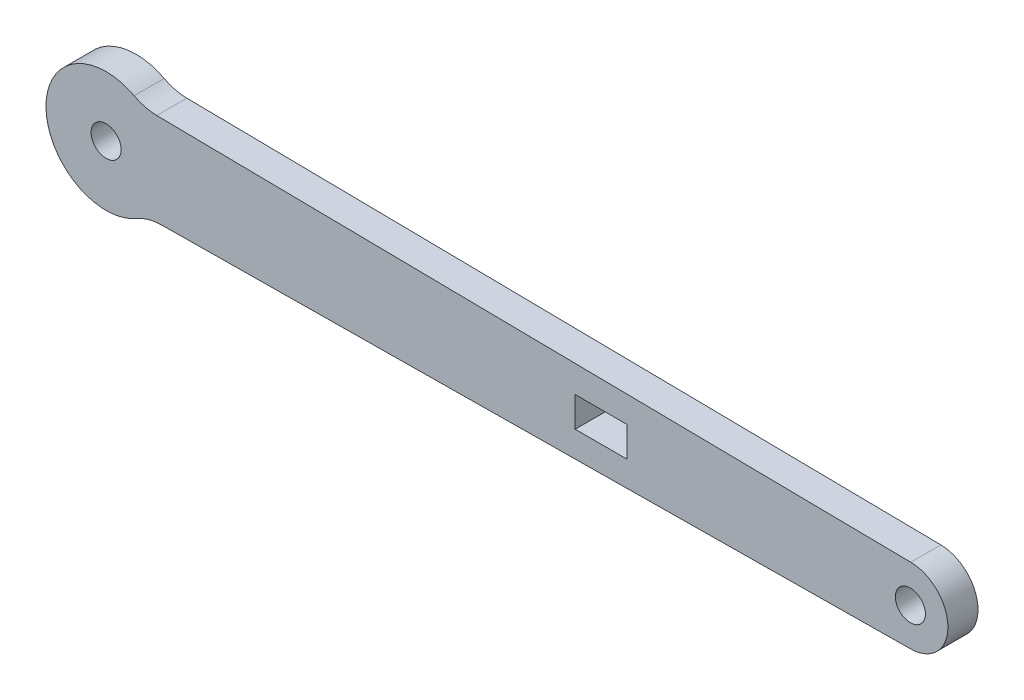
ISO-10303-21;
HEADER;
FILE_DESCRIPTION(('STEP AP214'),'2;1');
FILE_NAME('part.step','',(''),(''),'','','');
FILE_SCHEMA(('AUTOMOTIVE_DESIGN { 1 0 10303 214 1 1 1 1 }'));
ENDSEC;
DATA;
#1=APPLICATION_CONTEXT('core data for automotive mechanical design processes');
#2=APPLICATION_PROTOCOL_DEFINITION('international standard','automotive_design',2000,#1);
#3=PRODUCT_CONTEXT('',#1,'mechanical');
#4=PRODUCT('Part','Part','',(#3));
#5=PRODUCT_RELATED_PRODUCT_CATEGORY('part','',(#4));
#6=PRODUCT_DEFINITION_FORMATION('','',#4);
#7=PRODUCT_DEFINITION_CONTEXT('part definition',#1,'design');
#8=PRODUCT_DEFINITION('design','',#6,#7);
#9=PRODUCT_DEFINITION_SHAPE('','',#8);
#10=(LENGTH_UNIT() NAMED_UNIT(*) SI_UNIT(.MILLI.,.METRE.));
#11=(NAMED_UNIT(*) PLANE_ANGLE_UNIT() SI_UNIT($,.RADIAN.));
#12=(NAMED_UNIT(*) SI_UNIT($,.STERADIAN.) SOLID_ANGLE_UNIT());
#13=UNCERTAINTY_MEASURE_WITH_UNIT(LENGTH_MEASURE(1.E-05),#10,'distance_accuracy_value','');
#14=(GEOMETRIC_REPRESENTATION_CONTEXT(3) GLOBAL_UNCERTAINTY_ASSIGNED_CONTEXT((#13)) GLOBAL_UNIT_ASSIGNED_CONTEXT((#10,
#11,#12)) REPRESENTATION_CONTEXT('',''));
#15=CARTESIAN_POINT('',(0.,0.,0.));
#16=DIRECTION('',(0.,0.,1.));
#17=DIRECTION('',(1.,0.,0.));
#18=AXIS2_PLACEMENT_3D('',#15,#16,#17);
#19=CARTESIAN_POINT('',(15.3839225285986,1.49424389752999,-3.));
#20=DIRECTION('',(0.,0.,1.));
#21=DIRECTION('',(1.,0.,0.));
#22=AXIS2_PLACEMENT_3D('',#19,#20,#21);
#23=CYLINDRICAL_SURFACE('',#22,5.);
#24=CARTESIAN_POINT('',(15.3839225285986,1.49424389752999,0.));
#25=DIRECTION('',(0.,0.,-1.));
#26=DIRECTION('',(1.,0.,0.));
#27=AXIS2_PLACEMENT_3D('',#24,#25,#26);
#28=CIRCLE('',#27,5.);
#29=CARTESIAN_POINT('',(12.8512986774133,5.8053709460415,0.));
#30=VERTEX_POINT('',#29);
#31=CARTESIAN_POINT('',(15.3347648035818,6.49400224349744,0.));
#32=VERTEX_POINT('',#31);
#33=EDGE_CURVE('E160',#30,#32,#28,.T.);
#34=ORIENTED_EDGE('',*,*,#33,.F.);
#35=DIRECTION('',(0.,0.,1.));
#36=VECTOR('',#35,1.);
#37=CARTESIAN_POINT('',(12.8512986774133,5.8053709460415,-3.));
#38=LINE('',#37,#36);
#39=CARTESIAN_POINT('',(12.8512986774133,5.8053709460415,-3.));
#40=VERTEX_POINT('',#39);
#41=EDGE_CURVE('E11',#40,#30,#38,.T.);
#42=ORIENTED_EDGE('',*,*,#41,.F.);
#43=CARTESIAN_POINT('',(15.3839225285986,1.49424389752999,-3.));
#44=DIRECTION('',(0.,0.,-1.));
#45=DIRECTION('',(1.,0.,0.));
#46=AXIS2_PLACEMENT_3D('',#43,#44,#45);
#47=CIRCLE('',#46,5.);
#48=CARTESIAN_POINT('',(15.3347648035818,6.49400224349744,-3.));
#49=VERTEX_POINT('',#48);
#50=EDGE_CURVE('E163',#40,#49,#47,.T.);
#51=ORIENTED_EDGE('',*,*,#50,.T.);
#52=DIRECTION('',(0.,0.,1.));
#53=VECTOR('',#52,1.);
#54=CARTESIAN_POINT('',(15.3347648035818,6.49400224349744,-3.));
#55=LINE('',#54,#53);
#56=EDGE_CURVE('E42',#49,#32,#55,.T.);
#57=ORIENTED_EDGE('',*,*,#56,.T.);
#58=EDGE_LOOP('',(#34,#42,#51,#57));
#59=FACE_BOUND('',#58,.T.);
#60=ADVANCED_FACE('F39',(#59),#23,.F.);
#61=CARTESIAN_POINT('',(9.81215005599104,10.9787234042553,-3.));
#62=DIRECTION('',(0.,0.,1.));
#63=DIRECTION('',(1.,0.,0.));
#64=AXIS2_PLACEMENT_3D('',#61,#62,#63);
#65=CYLINDRICAL_SURFACE('',#64,6.);
#66=CARTESIAN_POINT('',(9.81215005599104,10.9787234042553,0.));
#67=DIRECTION('',(0.,0.,1.));
#68=DIRECTION('',(1.,0.,0.));
#69=AXIS2_PLACEMENT_3D('',#66,#67,#68);
#70=CIRCLE('',#69,6.);
#71=CARTESIAN_POINT('',(12.6069473489156,16.2880649916333,0.));
#72=VERTEX_POINT('',#71);
#73=EDGE_CURVE('E167',#72,#30,#70,.T.);
#74=ORIENTED_EDGE('',*,*,#73,.F.);
#75=DIRECTION('',(0.,0.,1.));
#76=VECTOR('',#75,1.);
#77=CARTESIAN_POINT('',(12.6069473489156,16.2880649916333,-3.));
#78=LINE('',#77,#76);
#79=CARTESIAN_POINT('',(12.6069473489156,16.2880649916333,-3.));
#80=VERTEX_POINT('',#79);
#81=EDGE_CURVE('E47',#80,#72,#78,.T.);
#82=ORIENTED_EDGE('',*,*,#81,.F.);
#83=CARTESIAN_POINT('',(9.81215005599104,10.9787234042553,-3.));
#84=DIRECTION('',(0.,0.,1.));
#85=DIRECTION('',(1.,0.,0.));
#86=AXIS2_PLACEMENT_3D('',#83,#84,#85);
#87=CIRCLE('',#86,6.);
#88=EDGE_CURVE('E179',#80,#40,#87,.T.);
#89=ORIENTED_EDGE('',*,*,#88,.T.);
#90=ORIENTED_EDGE('',*,*,#41,.T.);
#91=EDGE_LOOP('',(#74,#82,#89,#90));
#92=FACE_BOUND('',#91,.T.);
#93=ADVANCED_FACE('F216',(#92),#65,.T.);
#94=CARTESIAN_POINT('',(14.9359450930194,20.7125163144483,-3.));
#95=DIRECTION('',(0.,0.,1.));
#96=DIRECTION('',(1.,0.,0.));
#97=AXIS2_PLACEMENT_3D('',#94,#95,#96);
#98=CYLINDRICAL_SURFACE('',#97,5.);
#99=CARTESIAN_POINT('',(14.9359450930194,20.7125163144483,0.));
#100=DIRECTION('',(0.,0.,-1.));
#101=DIRECTION('',(-1.,0.,0.));
#102=AXIS2_PLACEMENT_3D('',#99,#100,#101);
#103=CIRCLE('',#102,5.);
#104=CARTESIAN_POINT('',(14.8705245322717,15.7129443177439,0.));
#105=VERTEX_POINT('',#104);
#106=EDGE_CURVE('E193',#105,#72,#103,.T.);
#107=ORIENTED_EDGE('',*,*,#106,.F.);
#108=DIRECTION('',(0.,0.,1.));
#109=VECTOR('',#108,1.);
#110=CARTESIAN_POINT('',(14.8705245322717,15.7129443177439,-3.));
#111=LINE('',#110,#109);
#112=CARTESIAN_POINT('',(14.8705245322717,15.7129443177439,-3.));
#113=VERTEX_POINT('',#112);
#114=EDGE_CURVE('E199',#113,#105,#111,.T.);
#115=ORIENTED_EDGE('',*,*,#114,.F.);
#116=CARTESIAN_POINT('',(14.9359450930194,20.7125163144483,-3.));
#117=DIRECTION('',(0.,0.,-1.));
#118=DIRECTION('',(-1.,0.,0.));
#119=AXIS2_PLACEMENT_3D('',#116,#117,#118);
#120=CIRCLE('',#119,5.);
#121=EDGE_CURVE('E176',#113,#80,#120,.T.);
#122=ORIENTED_EDGE('',*,*,#121,.T.);
#123=ORIENTED_EDGE('',*,*,#81,.T.);
#124=EDGE_LOOP('',(#107,#115,#122,#123));
#125=FACE_BOUND('',#124,.T.);
#126=ADVANCED_FACE('F228',(#125),#98,.F.);
#127=CARTESIAN_POINT('',(14.8705245322717,15.7129443177439,-3.));
#128=DIRECTION('',(0.0130841121495327,0.999914399340893,0.));
#129=DIRECTION('',(-0.999914399340893,0.0130841121495327,0.));
#130=AXIS2_PLACEMENT_3D('',#127,#128,#129);
#131=PLANE('',#130);
#132=DIRECTION('',(-0.999914399340893,0.0130841121495327,0.));
#133=VECTOR('',#132,1.);
#134=CARTESIAN_POINT('',(14.8705245322717,15.7129443177439,0.));
#135=LINE('',#134,#133);
#136=CARTESIAN_POINT('',(90.1112154765518,14.7284024017837,0.));
#137=VERTEX_POINT('',#136);
#138=EDGE_CURVE('E190',#137,#105,#135,.T.);
#139=ORIENTED_EDGE('',*,*,#138,.F.);
#140=DIRECTION('',(0.,0.,1.));
#141=VECTOR('',#140,1.);
#142=CARTESIAN_POINT('',(90.1112154765518,14.7284024017837,-3.));
#143=LINE('',#142,#141);
#144=CARTESIAN_POINT('',(90.1112154765518,14.7284024017837,-3.));
#145=VERTEX_POINT('',#144);
#146=EDGE_CURVE('E201',#145,#137,#143,.T.);
#147=ORIENTED_EDGE('',*,*,#146,.F.);
#148=DIRECTION('',(-0.999914399340893,0.0130841121495327,0.));
#149=VECTOR('',#148,1.);
#150=CARTESIAN_POINT('',(14.8705245322717,15.7129443177439,-3.));
#151=LINE('',#150,#149);
#152=EDGE_CURVE('E173',#145,#113,#151,.T.);
#153=ORIENTED_EDGE('',*,*,#152,.T.);
#154=ORIENTED_EDGE('',*,*,#114,.T.);
#155=EDGE_LOOP('',(#139,#147,#153,#154));
#156=FACE_BOUND('',#155,.T.);
#157=ADVANCED_FACE('F226',(#156),#131,.T.);
#158=CARTESIAN_POINT('',(90.062150055991,10.9787234042553,-3.));
#159=DIRECTION('',(0.,0.,1.));
#160=DIRECTION('',(1.,0.,0.));
#161=AXIS2_PLACEMENT_3D('',#158,#159,#160);
#162=CYLINDRICAL_SURFACE('',#161,3.75);
#163=CARTESIAN_POINT('',(90.062150055991,10.9787234042553,0.));
#164=DIRECTION('',(0.,0.,1.));
#165=DIRECTION('',(1.,0.,0.));
#166=AXIS2_PLACEMENT_3D('',#163,#164,#165);
#167=CIRCLE('',#166,3.75);
#168=CARTESIAN_POINT('',(90.062150055991,7.22872340425531,0.));
#169=VERTEX_POINT('',#168);
#170=EDGE_CURVE('E187',#169,#137,#167,.T.);
#171=ORIENTED_EDGE('',*,*,#170,.F.);
#172=DIRECTION('',(0.,0.,1.));
#173=VECTOR('',#172,1.);
#174=CARTESIAN_POINT('',(90.062150055991,7.22872340425531,-3.));
#175=LINE('',#174,#173);
#176=CARTESIAN_POINT('',(90.062150055991,7.22872340425531,-3.));
#177=VERTEX_POINT('',#176);
#178=EDGE_CURVE('E202',#177,#169,#175,.T.);
#179=ORIENTED_EDGE('',*,*,#178,.F.);
#180=CARTESIAN_POINT('',(90.062150055991,10.9787234042553,-3.));
#181=DIRECTION('',(0.,0.,1.));
#182=DIRECTION('',(1.,0.,0.));
#183=AXIS2_PLACEMENT_3D('',#180,#181,#182);
#184=CIRCLE('',#183,3.75);
#185=EDGE_CURVE('E170',#177,#145,#184,.T.);
#186=ORIENTED_EDGE('',*,*,#185,.T.);
#187=ORIENTED_EDGE('',*,*,#146,.T.);
#188=EDGE_LOOP('',(#171,#179,#186,#187));
#189=FACE_BOUND('',#188,.T.);
#190=ADVANCED_FACE('F223',(#189),#162,.T.);
#191=CARTESIAN_POINT('',(90.062150055991,7.22872340425531,-3.));
#192=DIRECTION('',(0.00983154500334841,-0.99995166919349,0.));
#193=DIRECTION('',(0.99995166919349,0.00983154500334841,0.));
#194=AXIS2_PLACEMENT_3D('',#191,#192,#193);
#195=PLANE('',#194);
#196=DIRECTION('',(0.99995166919349,0.00983154500334841,0.));
#197=VECTOR('',#196,1.);
#198=CARTESIAN_POINT('',(90.062150055991,7.22872340425531,0.));
#199=LINE('',#198,#197);
#200=EDGE_CURVE('E184',#32,#169,#199,.T.);
#201=ORIENTED_EDGE('',*,*,#200,.F.);
#202=ORIENTED_EDGE('',*,*,#56,.F.);
#203=DIRECTION('',(0.99995166919349,0.00983154500334841,0.));
#204=VECTOR('',#203,1.);
#205=CARTESIAN_POINT('',(90.062150055991,7.22872340425531,-3.));
#206=LINE('',#205,#204);
#207=EDGE_CURVE('E166',#49,#177,#206,.T.);
#208=ORIENTED_EDGE('',*,*,#207,.T.);
#209=ORIENTED_EDGE('',*,*,#178,.T.);
#210=EDGE_LOOP('',(#201,#202,#208,#209));
#211=FACE_BOUND('',#210,.T.);
#212=ADVANCED_FACE('F210',(#211),#195,.T.);
#213=CARTESIAN_POINT('',(15.3839225285986,1.49424389752999,-3.));
#214=DIRECTION('',(0.,0.,1.));
#215=DIRECTION('',(1.,0.,0.));
#216=AXIS2_PLACEMENT_3D('',#213,#214,#215);
#217=PLANE('',#216);
#218=CARTESIAN_POINT('',(90.062150055991,10.9787234042553,-3.));
#219=DIRECTION('',(0.,0.,1.));
#220=DIRECTION('',(1.,0.,0.));
#221=AXIS2_PLACEMENT_3D('',#218,#219,#220);
#222=CIRCLE('',#221,1.5);
#223=CARTESIAN_POINT('',(91.562150055991,10.9787234042553,-3.));
#224=VERTEX_POINT('',#223);
#225=EDGE_CURVE('E147',#224,#224,#222,.T.);
#226=ORIENTED_EDGE('',*,*,#225,.T.);
#227=EDGE_LOOP('',(#226));
#228=FACE_BOUND('',#227,.T.);
#229=DIRECTION('',(-1.,0.,0.));
#230=VECTOR('',#229,1.);
#231=CARTESIAN_POINT('',(56.612150055991,12.4787234042553,-3.));
#232=LINE('',#231,#230);
#233=CARTESIAN_POINT('',(61.812150055991,12.4787234042553,-3.));
#234=VERTEX_POINT('',#233);
#235=CARTESIAN_POINT('',(56.612150055991,12.4787234042553,-3.));
#236=VERTEX_POINT('',#235);
#237=EDGE_CURVE('E124',#234,#236,#232,.T.);
#238=ORIENTED_EDGE('',*,*,#237,.T.);
#239=DIRECTION('',(0.,-1.,0.));
#240=VECTOR('',#239,1.);
#241=CARTESIAN_POINT('',(56.612150055991,12.4787234042553,-3.));
#242=LINE('',#241,#240);
#243=CARTESIAN_POINT('',(56.612150055991,9.47872340425532,-3.));
#244=VERTEX_POINT('',#243);
#245=EDGE_CURVE('E118',#236,#244,#242,.T.);
#246=ORIENTED_EDGE('',*,*,#245,.T.);
#247=DIRECTION('',(1.,0.,0.));
#248=VECTOR('',#247,1.);
#249=CARTESIAN_POINT('',(56.612150055991,9.47872340425532,-3.));
#250=LINE('',#249,#248);
#251=CARTESIAN_POINT('',(61.812150055991,9.47872340425532,-3.));
#252=VERTEX_POINT('',#251);
#253=EDGE_CURVE('E127',#244,#252,#250,.T.);
#254=ORIENTED_EDGE('',*,*,#253,.T.);
#255=DIRECTION('',(0.,1.,0.));
#256=VECTOR('',#255,1.);
#257=CARTESIAN_POINT('',(61.812150055991,12.4787234042553,-3.));
#258=LINE('',#257,#256);
#259=EDGE_CURVE('E55',#252,#234,#258,.T.);
#260=ORIENTED_EDGE('',*,*,#259,.T.);
#261=EDGE_LOOP('',(#238,#246,#254,#260));
#262=FACE_BOUND('',#261,.T.);
#263=CARTESIAN_POINT('',(9.81215005599104,10.9787234042553,-3.));
#264=DIRECTION('',(0.,0.,1.));
#265=DIRECTION('',(1.,0.,0.));
#266=AXIS2_PLACEMENT_3D('',#263,#264,#265);
#267=CIRCLE('',#266,1.5);
#268=CARTESIAN_POINT('',(11.312150055991,10.9787234042553,-3.));
#269=VERTEX_POINT('',#268);
#270=EDGE_CURVE('E157',#269,#269,#267,.T.);
#271=ORIENTED_EDGE('',*,*,#270,.T.);
#272=EDGE_LOOP('',(#271));
#273=FACE_BOUND('',#272,.T.);
#274=ORIENTED_EDGE('',*,*,#50,.F.);
#275=ORIENTED_EDGE('',*,*,#88,.F.);
#276=ORIENTED_EDGE('',*,*,#121,.F.);
#277=ORIENTED_EDGE('',*,*,#152,.F.);
#278=ORIENTED_EDGE('',*,*,#185,.F.);
#279=ORIENTED_EDGE('',*,*,#207,.F.);
#280=EDGE_LOOP('',(#274,#275,#276,#277,#278,#279));
#281=FACE_BOUND('',#280,.T.);
#282=ADVANCED_FACE('F131',(#228,#262,#273,#281),#217,.F.);
#283=CARTESIAN_POINT('',(15.3839225285986,1.49424389752999,0.));
#284=DIRECTION('',(0.,0.,1.));
#285=DIRECTION('',(1.,0.,0.));
#286=AXIS2_PLACEMENT_3D('',#283,#284,#285);
#287=PLANE('',#286);
#288=CARTESIAN_POINT('',(90.062150055991,10.9787234042553,0.));
#289=DIRECTION('',(0.,0.,1.));
#290=DIRECTION('',(1.,0.,0.));
#291=AXIS2_PLACEMENT_3D('',#288,#289,#290);
#292=CIRCLE('',#291,1.5);
#293=CARTESIAN_POINT('',(91.562150055991,10.9787234042553,0.));
#294=VERTEX_POINT('',#293);
#295=EDGE_CURVE('E140',#294,#294,#292,.T.);
#296=ORIENTED_EDGE('',*,*,#295,.F.);
#297=EDGE_LOOP('',(#296));
#298=FACE_BOUND('',#297,.T.);
#299=DIRECTION('',(0.,-1.,0.));
#300=VECTOR('',#299,1.);
#301=CARTESIAN_POINT('',(56.612150055991,12.4787234042553,0.));
#302=LINE('',#301,#300);
#303=CARTESIAN_POINT('',(56.612150055991,12.4787234042553,0.));
#304=VERTEX_POINT('',#303);
#305=CARTESIAN_POINT('',(56.612150055991,9.47872340425532,0.));
#306=VERTEX_POINT('',#305);
#307=EDGE_CURVE('E63',#304,#306,#302,.T.);
#308=ORIENTED_EDGE('',*,*,#307,.F.);
#309=DIRECTION('',(-1.,0.,0.));
#310=VECTOR('',#309,1.);
#311=CARTESIAN_POINT('',(56.612150055991,12.4787234042553,0.));
#312=LINE('',#311,#310);
#313=CARTESIAN_POINT('',(61.812150055991,12.4787234042553,0.));
#314=VERTEX_POINT('',#313);
#315=EDGE_CURVE('E134',#314,#304,#312,.T.);
#316=ORIENTED_EDGE('',*,*,#315,.F.);
#317=DIRECTION('',(0.,1.,0.));
#318=VECTOR('',#317,1.);
#319=CARTESIAN_POINT('',(61.812150055991,12.4787234042553,0.));
#320=LINE('',#319,#318);
#321=CARTESIAN_POINT('',(61.812150055991,9.47872340425532,0.));
#322=VERTEX_POINT('',#321);
#323=EDGE_CURVE('E137',#322,#314,#320,.T.);
#324=ORIENTED_EDGE('',*,*,#323,.F.);
#325=DIRECTION('',(1.,0.,0.));
#326=VECTOR('',#325,1.);
#327=CARTESIAN_POINT('',(56.612150055991,9.47872340425532,0.));
#328=LINE('',#327,#326);
#329=EDGE_CURVE('E146',#306,#322,#328,.T.);
#330=ORIENTED_EDGE('',*,*,#329,.F.);
#331=EDGE_LOOP('',(#308,#316,#324,#330));
#332=FACE_BOUND('',#331,.T.);
#333=CARTESIAN_POINT('',(9.81215005599104,10.9787234042553,0.));
#334=DIRECTION('',(0.,0.,1.));
#335=DIRECTION('',(1.,0.,0.));
#336=AXIS2_PLACEMENT_3D('',#333,#334,#335);
#337=CIRCLE('',#336,1.5);
#338=CARTESIAN_POINT('',(11.312150055991,10.9787234042553,0.));
#339=VERTEX_POINT('',#338);
#340=EDGE_CURVE('E153',#339,#339,#337,.T.);
#341=ORIENTED_EDGE('',*,*,#340,.F.);
#342=EDGE_LOOP('',(#341));
#343=FACE_BOUND('',#342,.T.);
#344=ORIENTED_EDGE('',*,*,#33,.T.);
#345=ORIENTED_EDGE('',*,*,#200,.T.);
#346=ORIENTED_EDGE('',*,*,#170,.T.);
#347=ORIENTED_EDGE('',*,*,#138,.T.);
#348=ORIENTED_EDGE('',*,*,#106,.T.);
#349=ORIENTED_EDGE('',*,*,#73,.T.);
#350=EDGE_LOOP('',(#344,#345,#346,#347,#348,#349));
#351=FACE_BOUND('',#350,.T.);
#352=ADVANCED_FACE('F212',(#298,#332,#343,#351),#287,.T.);
#353=CARTESIAN_POINT('',(9.81215005599104,10.9787234042553,-3.));
#354=DIRECTION('',(0.,0.,1.));
#355=DIRECTION('',(1.,0.,0.));
#356=AXIS2_PLACEMENT_3D('',#353,#354,#355);
#357=CYLINDRICAL_SURFACE('',#356,1.5);
#358=ORIENTED_EDGE('',*,*,#270,.F.);
#359=EDGE_LOOP('',(#358));
#360=FACE_BOUND('',#359,.T.);
#361=ORIENTED_EDGE('',*,*,#340,.T.);
#362=EDGE_LOOP('',(#361));
#363=FACE_BOUND('',#362,.T.);
#364=ADVANCED_FACE('F293',(#360,#363),#357,.F.);
#365=CARTESIAN_POINT('',(56.612150055991,12.4787234042553,-3.));
#366=DIRECTION('',(-1.,0.,0.));
#367=DIRECTION('',(0.,0.,1.));
#368=AXIS2_PLACEMENT_3D('',#365,#366,#367);
#369=PLANE('',#368);
#370=ORIENTED_EDGE('',*,*,#307,.T.);
#371=DIRECTION('',(0.,0.,1.));
#372=VECTOR('',#371,1.);
#373=CARTESIAN_POINT('',(56.612150055991,9.47872340425532,-3.));
#374=LINE('',#373,#372);
#375=EDGE_CURVE('E114',#244,#306,#374,.T.);
#376=ORIENTED_EDGE('',*,*,#375,.F.);
#377=ORIENTED_EDGE('',*,*,#245,.F.);
#378=DIRECTION('',(0.,0.,1.));
#379=VECTOR('',#378,1.);
#380=CARTESIAN_POINT('',(56.612150055991,12.4787234042553,-3.));
#381=LINE('',#380,#379);
#382=EDGE_CURVE('E151',#236,#304,#381,.T.);
#383=ORIENTED_EDGE('',*,*,#382,.T.);
#384=EDGE_LOOP('',(#370,#376,#377,#383));
#385=FACE_BOUND('',#384,.T.);
#386=ADVANCED_FACE('F116',(#385),#369,.F.);
#387=CARTESIAN_POINT('',(56.612150055991,12.4787234042553,-3.));
#388=DIRECTION('',(0.,1.,0.));
#389=DIRECTION('',(0.,0.,1.));
#390=AXIS2_PLACEMENT_3D('',#387,#388,#389);
#391=PLANE('',#390);
#392=ORIENTED_EDGE('',*,*,#315,.T.);
#393=ORIENTED_EDGE('',*,*,#382,.F.);
#394=ORIENTED_EDGE('',*,*,#237,.F.);
#395=DIRECTION('',(0.,0.,1.));
#396=VECTOR('',#395,1.);
#397=CARTESIAN_POINT('',(61.812150055991,12.4787234042553,-3.));
#398=LINE('',#397,#396);
#399=EDGE_CURVE('E154',#234,#314,#398,.T.);
#400=ORIENTED_EDGE('',*,*,#399,.T.);
#401=EDGE_LOOP('',(#392,#393,#394,#400));
#402=FACE_BOUND('',#401,.T.);
#403=ADVANCED_FACE('F314',(#402),#391,.F.);
#404=CARTESIAN_POINT('',(61.812150055991,12.4787234042553,-3.));
#405=DIRECTION('',(1.,0.,0.));
#406=DIRECTION('',(0.,0.,-1.));
#407=AXIS2_PLACEMENT_3D('',#404,#405,#406);
#408=PLANE('',#407);
#409=ORIENTED_EDGE('',*,*,#323,.T.);
#410=ORIENTED_EDGE('',*,*,#399,.F.);
#411=ORIENTED_EDGE('',*,*,#259,.F.);
#412=DIRECTION('',(0.,0.,1.));
#413=VECTOR('',#412,1.);
#414=CARTESIAN_POINT('',(61.812150055991,9.47872340425532,-3.));
#415=LINE('',#414,#413);
#416=EDGE_CURVE('E123',#252,#322,#415,.T.);
#417=ORIENTED_EDGE('',*,*,#416,.T.);
#418=EDGE_LOOP('',(#409,#410,#411,#417));
#419=FACE_BOUND('',#418,.T.);
#420=ADVANCED_FACE('F324',(#419),#408,.F.);
#421=CARTESIAN_POINT('',(56.612150055991,9.47872340425532,-3.));
#422=DIRECTION('',(0.,-1.,0.));
#423=DIRECTION('',(0.,0.,-1.));
#424=AXIS2_PLACEMENT_3D('',#421,#422,#423);
#425=PLANE('',#424);
#426=ORIENTED_EDGE('',*,*,#329,.T.);
#427=ORIENTED_EDGE('',*,*,#416,.F.);
#428=ORIENTED_EDGE('',*,*,#253,.F.);
#429=ORIENTED_EDGE('',*,*,#375,.T.);
#430=EDGE_LOOP('',(#426,#427,#428,#429));
#431=FACE_BOUND('',#430,.T.);
#432=ADVANCED_FACE('F128',(#431),#425,.F.);
#433=CARTESIAN_POINT('',(90.062150055991,10.9787234042553,-3.));
#434=DIRECTION('',(0.,0.,1.));
#435=DIRECTION('',(1.,0.,0.));
#436=AXIS2_PLACEMENT_3D('',#433,#434,#435);
#437=CYLINDRICAL_SURFACE('',#436,1.5);
#438=ORIENTED_EDGE('',*,*,#225,.F.);
#439=EDGE_LOOP('',(#438));
#440=FACE_BOUND('',#439,.T.);
#441=ORIENTED_EDGE('',*,*,#295,.T.);
#442=EDGE_LOOP('',(#441));
#443=FACE_BOUND('',#442,.T.);
#444=ADVANCED_FACE('F344',(#440,#443),#437,.F.);
#445=CLOSED_SHELL('',(#60,#93,#126,#157,#190,#212,#282,#352,#364,#386,#403,#420,#432,#444));
#446=MANIFOLD_SOLID_BREP('B2',#445);
#447=ADVANCED_BREP_SHAPE_REPRESENTATION('',(#18,#446),#14);
#448=SHAPE_DEFINITION_REPRESENTATION(#9,#447);
ENDSEC;
END-ISO-10303-21;
